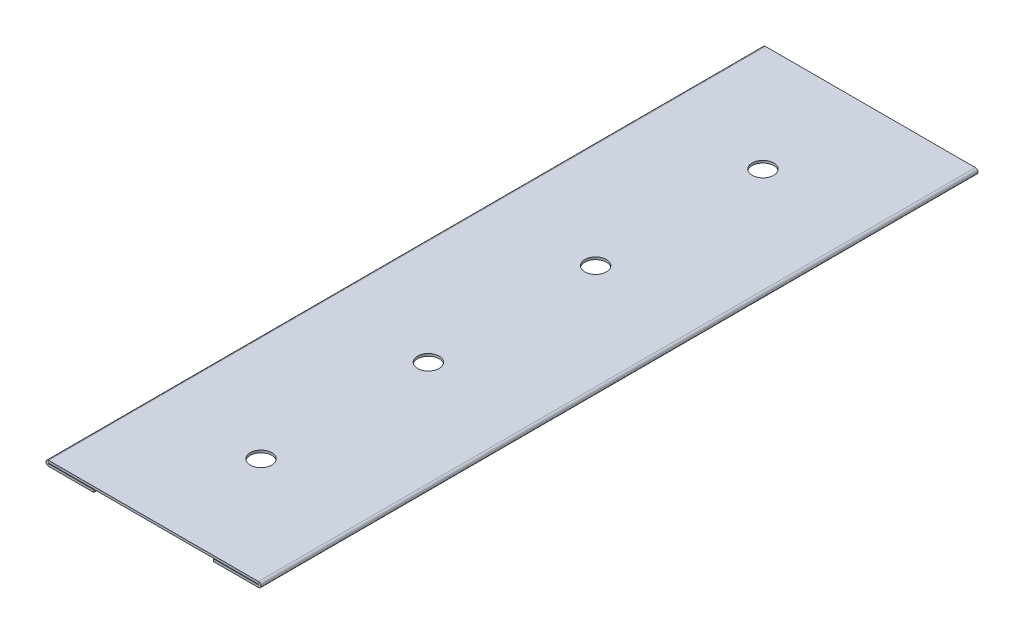
ISO-10303-21;
HEADER;
FILE_DESCRIPTION(('STEP AP214'),'2;1');
FILE_NAME('part.step','',(''),(''),'','','');
FILE_SCHEMA(('AUTOMOTIVE_DESIGN { 1 0 10303 214 1 1 1 1 }'));
ENDSEC;
DATA;
#1=APPLICATION_CONTEXT('core data for automotive mechanical design processes');
#2=APPLICATION_PROTOCOL_DEFINITION('international standard','automotive_design',2000,#1);
#3=PRODUCT_CONTEXT('',#1,'mechanical');
#4=PRODUCT('Part','Part','',(#3));
#5=PRODUCT_RELATED_PRODUCT_CATEGORY('part','',(#4));
#6=PRODUCT_DEFINITION_FORMATION('','',#4);
#7=PRODUCT_DEFINITION_CONTEXT('part definition',#1,'design');
#8=PRODUCT_DEFINITION('design','',#6,#7);
#9=PRODUCT_DEFINITION_SHAPE('','',#8);
#10=(LENGTH_UNIT() NAMED_UNIT(*) SI_UNIT(.MILLI.,.METRE.));
#11=(NAMED_UNIT(*) PLANE_ANGLE_UNIT() SI_UNIT($,.RADIAN.));
#12=(NAMED_UNIT(*) SI_UNIT($,.STERADIAN.) SOLID_ANGLE_UNIT());
#13=UNCERTAINTY_MEASURE_WITH_UNIT(LENGTH_MEASURE(1.E-05),#10,'distance_accuracy_value','');
#14=(GEOMETRIC_REPRESENTATION_CONTEXT(3) GLOBAL_UNCERTAINTY_ASSIGNED_CONTEXT((#13)) GLOBAL_UNIT_ASSIGNED_CONTEXT((#10,
#11,#12)) REPRESENTATION_CONTEXT('',''));
#15=CARTESIAN_POINT('',(0.,0.,0.));
#16=DIRECTION('',(0.,0.,1.));
#17=DIRECTION('',(1.,0.,0.));
#18=AXIS2_PLACEMENT_3D('',#15,#16,#17);
#19=CARTESIAN_POINT('',(-22.5,0.5,-75.));
#20=DIRECTION('',(0.,0.,1.));
#21=DIRECTION('',(-1.,0.,0.));
#22=AXIS2_PLACEMENT_3D('',#19,#20,#21);
#23=PLANE('',#22);
#24=DIRECTION('',(1.,0.,0.));
#25=VECTOR('',#24,1.);
#26=CARTESIAN_POINT('',(0.,0.,-75.));
#27=LINE('',#26,#25);
#28=CARTESIAN_POINT('',(21.95,0.,-75.));
#29=VERTEX_POINT('',#28);
#30=CARTESIAN_POINT('',(-21.95,0.,-75.));
#31=VERTEX_POINT('',#30);
#32=EDGE_CURVE('E42',#29,#31,#27,.F.);
#33=ORIENTED_EDGE('',*,*,#32,.T.);
#34=DIRECTION('',(0.,1.,0.));
#35=VECTOR('',#34,1.);
#36=CARTESIAN_POINT('',(-21.95,0.,-75.));
#37=LINE('',#36,#35);
#38=CARTESIAN_POINT('',(-21.95,0.5,-75.));
#39=VERTEX_POINT('',#38);
#40=EDGE_CURVE('E55',#31,#39,#37,.T.);
#41=ORIENTED_EDGE('',*,*,#40,.T.);
#42=DIRECTION('',(-1.,0.,0.));
#43=VECTOR('',#42,1.);
#44=CARTESIAN_POINT('',(-22.5,0.5,-75.));
#45=LINE('',#44,#43);
#46=CARTESIAN_POINT('',(21.95,0.5,-75.));
#47=VERTEX_POINT('',#46);
#48=EDGE_CURVE('E47',#47,#39,#45,.T.);
#49=ORIENTED_EDGE('',*,*,#48,.F.);
#50=DIRECTION('',(0.,1.,0.));
#51=VECTOR('',#50,1.);
#52=CARTESIAN_POINT('',(21.95,0.,-75.));
#53=LINE('',#52,#51);
#54=EDGE_CURVE('E215',#29,#47,#53,.T.);
#55=ORIENTED_EDGE('',*,*,#54,.F.);
#56=EDGE_LOOP('',(#33,#41,#49,#55));
#57=FACE_BOUND('',#56,.T.);
#58=ADVANCED_FACE('F39',(#57),#23,.F.);
#59=CARTESIAN_POINT('',(-22.5,0.5,75.));
#60=DIRECTION('',(0.,0.,-1.));
#61=DIRECTION('',(1.,0.,0.));
#62=AXIS2_PLACEMENT_3D('',#59,#60,#61);
#63=PLANE('',#62);
#64=DIRECTION('',(0.,1.,0.));
#65=VECTOR('',#64,1.);
#66=CARTESIAN_POINT('',(-21.95,0.,75.));
#67=LINE('',#66,#65);
#68=CARTESIAN_POINT('',(-21.95,0.,75.));
#69=VERTEX_POINT('',#68);
#70=CARTESIAN_POINT('',(-21.95,0.5,75.));
#71=VERTEX_POINT('',#70);
#72=EDGE_CURVE('E131',#69,#71,#67,.T.);
#73=ORIENTED_EDGE('',*,*,#72,.F.);
#74=DIRECTION('',(1.,0.,0.));
#75=VECTOR('',#74,1.);
#76=CARTESIAN_POINT('',(0.,0.,75.));
#77=LINE('',#76,#75);
#78=CARTESIAN_POINT('',(21.95,0.,75.));
#79=VERTEX_POINT('',#78);
#80=EDGE_CURVE('E257',#69,#79,#77,.T.);
#81=ORIENTED_EDGE('',*,*,#80,.T.);
#82=DIRECTION('',(0.,1.,0.));
#83=VECTOR('',#82,1.);
#84=CARTESIAN_POINT('',(21.95,0.,75.));
#85=LINE('',#84,#83);
#86=CARTESIAN_POINT('',(21.95,0.5,75.));
#87=VERTEX_POINT('',#86);
#88=EDGE_CURVE('E133',#79,#87,#85,.T.);
#89=ORIENTED_EDGE('',*,*,#88,.T.);
#90=DIRECTION('',(1.,0.,0.));
#91=VECTOR('',#90,1.);
#92=CARTESIAN_POINT('',(-22.5,0.5,75.));
#93=LINE('',#92,#91);
#94=EDGE_CURVE('E11',#71,#87,#93,.T.);
#95=ORIENTED_EDGE('',*,*,#94,.F.);
#96=EDGE_LOOP('',(#73,#81,#89,#95));
#97=FACE_BOUND('',#96,.T.);
#98=ADVANCED_FACE('F129',(#97),#63,.F.);
#99=CARTESIAN_POINT('',(2.59818126908183E-12,0.5,52.5));
#100=DIRECTION('',(0.,-1.,0.));
#101=DIRECTION('',(0.,0.,-1.));
#102=AXIS2_PLACEMENT_3D('',#99,#100,#101);
#103=CYLINDRICAL_SURFACE('',#102,2.25);
#104=CARTESIAN_POINT('',(2.59818126908183E-12,0.5,52.5));
#105=DIRECTION('',(0.,1.,0.));
#106=DIRECTION('',(0.,0.,1.));
#107=AXIS2_PLACEMENT_3D('',#104,#105,#106);
#108=CIRCLE('',#107,2.25);
#109=CARTESIAN_POINT('',(2.59818126908183E-12,0.5,54.75));
#110=VERTEX_POINT('',#109);
#111=EDGE_CURVE('E253',#110,#110,#108,.T.);
#112=ORIENTED_EDGE('',*,*,#111,.T.);
#113=EDGE_LOOP('',(#112));
#114=FACE_BOUND('',#113,.T.);
#115=CARTESIAN_POINT('',(2.59818126908183E-12,0.,52.5));
#116=DIRECTION('',(0.,1.,0.));
#117=DIRECTION('',(0.,0.,1.));
#118=AXIS2_PLACEMENT_3D('',#115,#116,#117);
#119=CIRCLE('',#118,2.25);
#120=CARTESIAN_POINT('',(2.59818126908183E-12,0.,54.75));
#121=VERTEX_POINT('',#120);
#122=EDGE_CURVE('E251',#121,#121,#119,.T.);
#123=ORIENTED_EDGE('',*,*,#122,.F.);
#124=EDGE_LOOP('',(#123));
#125=FACE_BOUND('',#124,.T.);
#126=ADVANCED_FACE('F313',(#114,#125),#103,.F.);
#127=CARTESIAN_POINT('',(1.73419581347123E-12,0.5,17.5));
#128=DIRECTION('',(0.,-1.,0.));
#129=DIRECTION('',(0.,0.,-1.));
#130=AXIS2_PLACEMENT_3D('',#127,#128,#129);
#131=CYLINDRICAL_SURFACE('',#130,2.25);
#132=CARTESIAN_POINT('',(1.73419581347123E-12,0.5,17.5));
#133=DIRECTION('',(0.,1.,0.));
#134=DIRECTION('',(0.,0.,1.));
#135=AXIS2_PLACEMENT_3D('',#132,#133,#134);
#136=CIRCLE('',#135,2.25);
#137=CARTESIAN_POINT('',(1.73419581347123E-12,0.5,19.75));
#138=VERTEX_POINT('',#137);
#139=EDGE_CURVE('E256',#138,#138,#136,.T.);
#140=ORIENTED_EDGE('',*,*,#139,.T.);
#141=EDGE_LOOP('',(#140));
#142=FACE_BOUND('',#141,.T.);
#143=CARTESIAN_POINT('',(1.73419581347123E-12,0.,17.5));
#144=DIRECTION('',(0.,1.,0.));
#145=DIRECTION('',(0.,0.,1.));
#146=AXIS2_PLACEMENT_3D('',#143,#144,#145);
#147=CIRCLE('',#146,2.25);
#148=CARTESIAN_POINT('',(1.73419581347123E-12,0.,19.75));
#149=VERTEX_POINT('',#148);
#150=EDGE_CURVE('E269',#149,#149,#147,.T.);
#151=ORIENTED_EDGE('',*,*,#150,.F.);
#152=EDGE_LOOP('',(#151));
#153=FACE_BOUND('',#152,.T.);
#154=ADVANCED_FACE('F317',(#142,#153),#131,.F.);
#155=CARTESIAN_POINT('',(0.,0.5,-52.5));
#156=DIRECTION('',(0.,-1.,0.));
#157=DIRECTION('',(0.,0.,-1.));
#158=AXIS2_PLACEMENT_3D('',#155,#156,#157);
#159=CYLINDRICAL_SURFACE('',#158,2.25);
#160=CARTESIAN_POINT('',(0.,0.5,-52.5));
#161=DIRECTION('',(0.,1.,0.));
#162=DIRECTION('',(0.,0.,1.));
#163=AXIS2_PLACEMENT_3D('',#160,#161,#162);
#164=CIRCLE('',#163,2.25);
#165=CARTESIAN_POINT('',(0.,0.5,-50.25));
#166=VERTEX_POINT('',#165);
#167=EDGE_CURVE('E260',#166,#166,#164,.T.);
#168=ORIENTED_EDGE('',*,*,#167,.T.);
#169=EDGE_LOOP('',(#168));
#170=FACE_BOUND('',#169,.T.);
#171=CARTESIAN_POINT('',(0.,0.,-52.5));
#172=DIRECTION('',(0.,1.,0.));
#173=DIRECTION('',(0.,0.,1.));
#174=AXIS2_PLACEMENT_3D('',#171,#172,#173);
#175=CIRCLE('',#174,2.25);
#176=CARTESIAN_POINT('',(0.,0.,-50.25));
#177=VERTEX_POINT('',#176);
#178=EDGE_CURVE('E272',#177,#177,#175,.T.);
#179=ORIENTED_EDGE('',*,*,#178,.F.);
#180=EDGE_LOOP('',(#179));
#181=FACE_BOUND('',#180,.T.);
#182=ADVANCED_FACE('F324',(#170,#181),#159,.F.);
#183=CARTESIAN_POINT('',(8.70210357860634E-13,0.5,-17.5));
#184=DIRECTION('',(0.,-1.,0.));
#185=DIRECTION('',(0.,0.,-1.));
#186=AXIS2_PLACEMENT_3D('',#183,#184,#185);
#187=CYLINDRICAL_SURFACE('',#186,2.25);
#188=CARTESIAN_POINT('',(8.70210357860634E-13,0.5,-17.5));
#189=DIRECTION('',(0.,1.,0.));
#190=DIRECTION('',(0.,0.,1.));
#191=AXIS2_PLACEMENT_3D('',#188,#189,#190);
#192=CIRCLE('',#191,2.25);
#193=CARTESIAN_POINT('',(8.70210357860634E-13,0.5,-15.25));
#194=VERTEX_POINT('',#193);
#195=EDGE_CURVE('E263',#194,#194,#192,.T.);
#196=ORIENTED_EDGE('',*,*,#195,.T.);
#197=EDGE_LOOP('',(#196));
#198=FACE_BOUND('',#197,.T.);
#199=CARTESIAN_POINT('',(8.70210357860634E-13,0.,-17.5));
#200=DIRECTION('',(0.,1.,0.));
#201=DIRECTION('',(0.,0.,1.));
#202=AXIS2_PLACEMENT_3D('',#199,#200,#201);
#203=CIRCLE('',#202,2.25);
#204=CARTESIAN_POINT('',(8.70210357860634E-13,0.,-15.25));
#205=VERTEX_POINT('',#204);
#206=EDGE_CURVE('E275',#205,#205,#203,.T.);
#207=ORIENTED_EDGE('',*,*,#206,.F.);
#208=EDGE_LOOP('',(#207));
#209=FACE_BOUND('',#208,.T.);
#210=ADVANCED_FACE('F321',(#198,#209),#187,.F.);
#211=CARTESIAN_POINT('',(0.,0.5,0.));
#212=DIRECTION('',(0.,-1.,0.));
#213=DIRECTION('',(0.,0.,-1.));
#214=AXIS2_PLACEMENT_3D('',#211,#212,#213);
#215=PLANE('',#214);
#216=ORIENTED_EDGE('',*,*,#111,.F.);
#217=EDGE_LOOP('',(#216));
#218=FACE_BOUND('',#217,.T.);
#219=ORIENTED_EDGE('',*,*,#139,.F.);
#220=EDGE_LOOP('',(#219));
#221=FACE_BOUND('',#220,.T.);
#222=ORIENTED_EDGE('',*,*,#167,.F.);
#223=EDGE_LOOP('',(#222));
#224=FACE_BOUND('',#223,.T.);
#225=ORIENTED_EDGE('',*,*,#195,.F.);
#226=EDGE_LOOP('',(#225));
#227=FACE_BOUND('',#226,.T.);
#228=ORIENTED_EDGE('',*,*,#48,.T.);
#229=DIRECTION('',(0.,0.,-1.));
#230=VECTOR('',#229,1.);
#231=CARTESIAN_POINT('',(-21.95,0.5,-75.));
#232=LINE('',#231,#230);
#233=EDGE_CURVE('E138',#39,#71,#232,.F.);
#234=ORIENTED_EDGE('',*,*,#233,.T.);
#235=ORIENTED_EDGE('',*,*,#94,.T.);
#236=DIRECTION('',(0.,0.,1.));
#237=VECTOR('',#236,1.);
#238=CARTESIAN_POINT('',(21.95,0.5,75.));
#239=LINE('',#238,#237);
#240=EDGE_CURVE('E199',#87,#47,#239,.F.);
#241=ORIENTED_EDGE('',*,*,#240,.T.);
#242=EDGE_LOOP('',(#228,#234,#235,#241));
#243=FACE_BOUND('',#242,.T.);
#244=ADVANCED_FACE('F139',(#218,#221,#224,#227,#243),#215,.F.);
#245=CARTESIAN_POINT('',(0.,0.,0.));
#246=DIRECTION('',(0.,-1.,0.));
#247=DIRECTION('',(0.,0.,-1.));
#248=AXIS2_PLACEMENT_3D('',#245,#246,#247);
#249=PLANE('',#248);
#250=DIRECTION('',(0.,0.,-1.));
#251=VECTOR('',#250,1.);
#252=CARTESIAN_POINT('',(-21.95,0.,-75.));
#253=LINE('',#252,#251);
#254=EDGE_CURVE('E63',#31,#69,#253,.F.);
#255=ORIENTED_EDGE('',*,*,#254,.F.);
#256=ORIENTED_EDGE('',*,*,#32,.F.);
#257=DIRECTION('',(0.,0.,1.));
#258=VECTOR('',#257,1.);
#259=CARTESIAN_POINT('',(21.95,0.,75.));
#260=LINE('',#259,#258);
#261=EDGE_CURVE('E210',#79,#29,#260,.F.);
#262=ORIENTED_EDGE('',*,*,#261,.F.);
#263=ORIENTED_EDGE('',*,*,#80,.F.);
#264=EDGE_LOOP('',(#255,#256,#262,#263));
#265=FACE_BOUND('',#264,.T.);
#266=ORIENTED_EDGE('',*,*,#122,.T.);
#267=EDGE_LOOP('',(#266));
#268=FACE_BOUND('',#267,.T.);
#269=ORIENTED_EDGE('',*,*,#150,.T.);
#270=EDGE_LOOP('',(#269));
#271=FACE_BOUND('',#270,.T.);
#272=ORIENTED_EDGE('',*,*,#178,.T.);
#273=EDGE_LOOP('',(#272));
#274=FACE_BOUND('',#273,.T.);
#275=ORIENTED_EDGE('',*,*,#206,.T.);
#276=EDGE_LOOP('',(#275));
#277=FACE_BOUND('',#276,.T.);
#278=ADVANCED_FACE('F332',(#265,#268,#271,#274,#277),#249,.T.);
#279=CARTESIAN_POINT('',(17.225,-0.6,75.));
#280=DIRECTION('',(0.,0.,-1.));
#281=DIRECTION('',(1.,0.,0.));
#282=AXIS2_PLACEMENT_3D('',#279,#280,#281);
#283=PLANE('',#282);
#284=DIRECTION('',(0.,-1.,0.));
#285=VECTOR('',#284,1.);
#286=CARTESIAN_POINT('',(21.95,-0.6,75.));
#287=LINE('',#286,#285);
#288=CARTESIAN_POINT('',(21.95,-0.1,75.));
#289=VERTEX_POINT('',#288);
#290=CARTESIAN_POINT('',(21.95,-0.6,75.));
#291=VERTEX_POINT('',#290);
#292=EDGE_CURVE('E245',#289,#291,#287,.T.);
#293=ORIENTED_EDGE('',*,*,#292,.F.);
#294=DIRECTION('',(1.,0.,0.));
#295=VECTOR('',#294,1.);
#296=CARTESIAN_POINT('',(17.225,-0.1,75.));
#297=LINE('',#296,#295);
#298=CARTESIAN_POINT('',(12.5,-0.1,75.));
#299=VERTEX_POINT('',#298);
#300=EDGE_CURVE('E236',#299,#289,#297,.T.);
#301=ORIENTED_EDGE('',*,*,#300,.F.);
#302=DIRECTION('',(0.,-1.,0.));
#303=VECTOR('',#302,1.);
#304=CARTESIAN_POINT('',(12.5,-0.6,75.));
#305=LINE('',#304,#303);
#306=CARTESIAN_POINT('',(12.5,-0.6,75.));
#307=VERTEX_POINT('',#306);
#308=EDGE_CURVE('E243',#299,#307,#305,.T.);
#309=ORIENTED_EDGE('',*,*,#308,.T.);
#310=DIRECTION('',(1.,0.,0.));
#311=VECTOR('',#310,1.);
#312=CARTESIAN_POINT('',(17.225,-0.6,75.));
#313=LINE('',#312,#311);
#314=EDGE_CURVE('E224',#307,#291,#313,.T.);
#315=ORIENTED_EDGE('',*,*,#314,.T.);
#316=EDGE_LOOP('',(#293,#301,#309,#315));
#317=FACE_BOUND('',#316,.T.);
#318=ADVANCED_FACE('F335',(#317),#283,.F.);
#319=CARTESIAN_POINT('',(12.5,-0.6,0.));
#320=DIRECTION('',(1.,0.,0.));
#321=DIRECTION('',(0.,0.,1.));
#322=AXIS2_PLACEMENT_3D('',#319,#320,#321);
#323=PLANE('',#322);
#324=ORIENTED_EDGE('',*,*,#308,.F.);
#325=DIRECTION('',(0.,0.,-1.));
#326=VECTOR('',#325,1.);
#327=CARTESIAN_POINT('',(12.5,-0.1,0.));
#328=LINE('',#327,#326);
#329=CARTESIAN_POINT('',(12.5,-0.1,-75.));
#330=VERTEX_POINT('',#329);
#331=EDGE_CURVE('E233',#330,#299,#328,.F.);
#332=ORIENTED_EDGE('',*,*,#331,.F.);
#333=DIRECTION('',(0.,-1.,0.));
#334=VECTOR('',#333,1.);
#335=CARTESIAN_POINT('',(12.5,-0.6,-75.));
#336=LINE('',#335,#334);
#337=CARTESIAN_POINT('',(12.5,-0.6,-75.));
#338=VERTEX_POINT('',#337);
#339=EDGE_CURVE('E223',#330,#338,#336,.T.);
#340=ORIENTED_EDGE('',*,*,#339,.T.);
#341=DIRECTION('',(0.,0.,1.));
#342=VECTOR('',#341,1.);
#343=CARTESIAN_POINT('',(12.5,-0.6,0.));
#344=LINE('',#343,#342);
#345=EDGE_CURVE('E220',#338,#307,#344,.T.);
#346=ORIENTED_EDGE('',*,*,#345,.T.);
#347=EDGE_LOOP('',(#324,#332,#340,#346));
#348=FACE_BOUND('',#347,.T.);
#349=ADVANCED_FACE('F343',(#348),#323,.F.);
#350=CARTESIAN_POINT('',(17.225,-0.6,-75.));
#351=DIRECTION('',(0.,0.,1.));
#352=DIRECTION('',(-1.,0.,0.));
#353=AXIS2_PLACEMENT_3D('',#350,#351,#352);
#354=PLANE('',#353);
#355=DIRECTION('',(1.,0.,0.));
#356=VECTOR('',#355,1.);
#357=CARTESIAN_POINT('',(17.225,-0.1,-75.));
#358=LINE('',#357,#356);
#359=CARTESIAN_POINT('',(21.95,-0.1,-75.));
#360=VERTEX_POINT('',#359);
#361=EDGE_CURVE('E218',#360,#330,#358,.F.);
#362=ORIENTED_EDGE('',*,*,#361,.F.);
#363=DIRECTION('',(0.,-1.,0.));
#364=VECTOR('',#363,1.);
#365=CARTESIAN_POINT('',(21.95,-0.6,-75.));
#366=LINE('',#365,#364);
#367=CARTESIAN_POINT('',(21.95,-0.6,-75.));
#368=VERTEX_POINT('',#367);
#369=EDGE_CURVE('E248',#360,#368,#366,.T.);
#370=ORIENTED_EDGE('',*,*,#369,.T.);
#371=DIRECTION('',(-1.,0.,0.));
#372=VECTOR('',#371,1.);
#373=CARTESIAN_POINT('',(17.225,-0.6,-75.));
#374=LINE('',#373,#372);
#375=EDGE_CURVE('E230',#368,#338,#374,.T.);
#376=ORIENTED_EDGE('',*,*,#375,.T.);
#377=ORIENTED_EDGE('',*,*,#339,.F.);
#378=EDGE_LOOP('',(#362,#370,#376,#377));
#379=FACE_BOUND('',#378,.T.);
#380=ADVANCED_FACE('F339',(#379),#354,.F.);
#381=CARTESIAN_POINT('',(17.225,-0.6,0.));
#382=DIRECTION('',(0.,-1.,0.));
#383=DIRECTION('',(0.,0.,-1.));
#384=AXIS2_PLACEMENT_3D('',#381,#382,#383);
#385=PLANE('',#384);
#386=ORIENTED_EDGE('',*,*,#345,.F.);
#387=ORIENTED_EDGE('',*,*,#375,.F.);
#388=DIRECTION('',(0.,0.,-1.));
#389=VECTOR('',#388,1.);
#390=CARTESIAN_POINT('',(21.95,-0.6,0.));
#391=LINE('',#390,#389);
#392=EDGE_CURVE('E227',#291,#368,#391,.T.);
#393=ORIENTED_EDGE('',*,*,#392,.F.);
#394=ORIENTED_EDGE('',*,*,#314,.F.);
#395=EDGE_LOOP('',(#386,#387,#393,#394));
#396=FACE_BOUND('',#395,.T.);
#397=ADVANCED_FACE('F342',(#396),#385,.T.);
#398=CARTESIAN_POINT('',(17.225,-0.1,0.));
#399=DIRECTION('',(0.,-1.,0.));
#400=DIRECTION('',(0.,0.,-1.));
#401=AXIS2_PLACEMENT_3D('',#398,#399,#400);
#402=PLANE('',#401);
#403=ORIENTED_EDGE('',*,*,#331,.T.);
#404=ORIENTED_EDGE('',*,*,#300,.T.);
#405=DIRECTION('',(0.,0.,-1.));
#406=VECTOR('',#405,1.);
#407=CARTESIAN_POINT('',(21.95,-0.1,0.));
#408=LINE('',#407,#406);
#409=EDGE_CURVE('E239',#289,#360,#408,.T.);
#410=ORIENTED_EDGE('',*,*,#409,.T.);
#411=ORIENTED_EDGE('',*,*,#361,.T.);
#412=EDGE_LOOP('',(#403,#404,#410,#411));
#413=FACE_BOUND('',#412,.T.);
#414=ADVANCED_FACE('F351',(#413),#402,.F.);
#415=CARTESIAN_POINT('',(21.95,-0.05,-75.));
#416=DIRECTION('',(0.,0.,-1.));
#417=DIRECTION('',(-1.,0.,0.));
#418=AXIS2_PLACEMENT_3D('',#415,#416,#417);
#419=PLANE('',#418);
#420=ORIENTED_EDGE('',*,*,#369,.F.);
#421=CARTESIAN_POINT('',(21.95,-0.05,-75.));
#422=DIRECTION('',(0.,0.,1.));
#423=DIRECTION('',(1.,0.,0.));
#424=AXIS2_PLACEMENT_3D('',#421,#422,#423);
#425=CIRCLE('',#424,0.05);
#426=EDGE_CURVE('E207',#29,#360,#425,.F.);
#427=ORIENTED_EDGE('',*,*,#426,.F.);
#428=ORIENTED_EDGE('',*,*,#54,.T.);
#429=CARTESIAN_POINT('',(21.95,-0.05,-75.));
#430=DIRECTION('',(0.,0.,1.));
#431=DIRECTION('',(1.,0.,0.));
#432=AXIS2_PLACEMENT_3D('',#429,#430,#431);
#433=CIRCLE('',#432,0.55);
#434=EDGE_CURVE('E201',#47,#368,#433,.F.);
#435=ORIENTED_EDGE('',*,*,#434,.T.);
#436=EDGE_LOOP('',(#420,#427,#428,#435));
#437=FACE_BOUND('',#436,.T.);
#438=ADVANCED_FACE('F354',(#437),#419,.T.);
#439=CARTESIAN_POINT('',(21.95,-0.05,75.));
#440=DIRECTION('',(0.,0.,-1.));
#441=DIRECTION('',(-1.,0.,0.));
#442=AXIS2_PLACEMENT_3D('',#439,#440,#441);
#443=PLANE('',#442);
#444=CARTESIAN_POINT('',(21.95,-0.05,75.));
#445=DIRECTION('',(0.,0.,1.));
#446=DIRECTION('',(1.,0.,0.));
#447=AXIS2_PLACEMENT_3D('',#444,#445,#446);
#448=CIRCLE('',#447,0.05);
#449=EDGE_CURVE('E197',#289,#79,#448,.T.);
#450=ORIENTED_EDGE('',*,*,#449,.F.);
#451=ORIENTED_EDGE('',*,*,#292,.T.);
#452=CARTESIAN_POINT('',(21.95,-0.05,75.));
#453=DIRECTION('',(0.,0.,1.));
#454=DIRECTION('',(1.,0.,0.));
#455=AXIS2_PLACEMENT_3D('',#452,#453,#454);
#456=CIRCLE('',#455,0.55);
#457=EDGE_CURVE('E202',#291,#87,#456,.T.);
#458=ORIENTED_EDGE('',*,*,#457,.T.);
#459=ORIENTED_EDGE('',*,*,#88,.F.);
#460=EDGE_LOOP('',(#450,#451,#458,#459));
#461=FACE_BOUND('',#460,.T.);
#462=ADVANCED_FACE('F359',(#461),#443,.F.);
#463=CARTESIAN_POINT('',(21.95,-0.05,75.));
#464=DIRECTION('',(0.,0.,1.));
#465=DIRECTION('',(0.,-1.,0.));
#466=AXIS2_PLACEMENT_3D('',#463,#464,#465);
#467=CYLINDRICAL_SURFACE('',#466,0.55);
#468=ORIENTED_EDGE('',*,*,#240,.F.);
#469=ORIENTED_EDGE('',*,*,#457,.F.);
#470=ORIENTED_EDGE('',*,*,#392,.T.);
#471=ORIENTED_EDGE('',*,*,#434,.F.);
#472=EDGE_LOOP('',(#468,#469,#470,#471));
#473=FACE_BOUND('',#472,.T.);
#474=ADVANCED_FACE('F362',(#473),#467,.T.);
#475=CARTESIAN_POINT('',(21.95,-0.05,75.));
#476=DIRECTION('',(0.,0.,1.));
#477=DIRECTION('',(0.,-1.,0.));
#478=AXIS2_PLACEMENT_3D('',#475,#476,#477);
#479=CYLINDRICAL_SURFACE('',#478,0.05);
#480=ORIENTED_EDGE('',*,*,#261,.T.);
#481=ORIENTED_EDGE('',*,*,#426,.T.);
#482=ORIENTED_EDGE('',*,*,#409,.F.);
#483=ORIENTED_EDGE('',*,*,#449,.T.);
#484=EDGE_LOOP('',(#480,#481,#482,#483));
#485=FACE_BOUND('',#484,.T.);
#486=ADVANCED_FACE('F367',(#485),#479,.F.);
#487=CARTESIAN_POINT('',(-17.225,-0.6,-75.));
#488=DIRECTION('',(0.,0.,1.));
#489=DIRECTION('',(-1.,0.,0.));
#490=AXIS2_PLACEMENT_3D('',#487,#488,#489);
#491=PLANE('',#490);
#492=DIRECTION('',(0.,-1.,0.));
#493=VECTOR('',#492,1.);
#494=CARTESIAN_POINT('',(-21.95,-0.6,-75.));
#495=LINE('',#494,#493);
#496=CARTESIAN_POINT('',(-21.95,-0.1,-75.));
#497=VERTEX_POINT('',#496);
#498=CARTESIAN_POINT('',(-21.95,-0.6,-75.));
#499=VERTEX_POINT('',#498);
#500=EDGE_CURVE('E191',#497,#499,#495,.T.);
#501=ORIENTED_EDGE('',*,*,#500,.F.);
#502=DIRECTION('',(1.,0.,0.));
#503=VECTOR('',#502,1.);
#504=CARTESIAN_POINT('',(-17.225,-0.1,-75.));
#505=LINE('',#504,#503);
#506=CARTESIAN_POINT('',(-12.5,-0.1,-75.));
#507=VERTEX_POINT('',#506);
#508=EDGE_CURVE('E182',#507,#497,#505,.F.);
#509=ORIENTED_EDGE('',*,*,#508,.F.);
#510=DIRECTION('',(0.,-1.,0.));
#511=VECTOR('',#510,1.);
#512=CARTESIAN_POINT('',(-12.5,-0.6,-75.));
#513=LINE('',#512,#511);
#514=CARTESIAN_POINT('',(-12.5,-0.6,-75.));
#515=VERTEX_POINT('',#514);
#516=EDGE_CURVE('E189',#507,#515,#513,.T.);
#517=ORIENTED_EDGE('',*,*,#516,.T.);
#518=DIRECTION('',(-1.,0.,0.));
#519=VECTOR('',#518,1.);
#520=CARTESIAN_POINT('',(-17.225,-0.6,-75.));
#521=LINE('',#520,#519);
#522=EDGE_CURVE('E172',#515,#499,#521,.T.);
#523=ORIENTED_EDGE('',*,*,#522,.T.);
#524=EDGE_LOOP('',(#501,#509,#517,#523));
#525=FACE_BOUND('',#524,.T.);
#526=ADVANCED_FACE('F297',(#525),#491,.F.);
#527=CARTESIAN_POINT('',(-12.5,-0.6,0.));
#528=DIRECTION('',(-1.,0.,0.));
#529=DIRECTION('',(0.,0.,-1.));
#530=AXIS2_PLACEMENT_3D('',#527,#528,#529);
#531=PLANE('',#530);
#532=ORIENTED_EDGE('',*,*,#516,.F.);
#533=DIRECTION('',(0.,0.,-1.));
#534=VECTOR('',#533,1.);
#535=CARTESIAN_POINT('',(-12.5,-0.1,0.));
#536=LINE('',#535,#534);
#537=CARTESIAN_POINT('',(-12.5,-0.1,75.));
#538=VERTEX_POINT('',#537);
#539=EDGE_CURVE('E179',#538,#507,#536,.T.);
#540=ORIENTED_EDGE('',*,*,#539,.F.);
#541=DIRECTION('',(0.,-1.,0.));
#542=VECTOR('',#541,1.);
#543=CARTESIAN_POINT('',(-12.5,-0.6,75.));
#544=LINE('',#543,#542);
#545=CARTESIAN_POINT('',(-12.5,-0.6,75.));
#546=VERTEX_POINT('',#545);
#547=EDGE_CURVE('E171',#538,#546,#544,.T.);
#548=ORIENTED_EDGE('',*,*,#547,.T.);
#549=DIRECTION('',(0.,0.,-1.));
#550=VECTOR('',#549,1.);
#551=CARTESIAN_POINT('',(-12.5,-0.6,0.));
#552=LINE('',#551,#550);
#553=EDGE_CURVE('E168',#546,#515,#552,.T.);
#554=ORIENTED_EDGE('',*,*,#553,.T.);
#555=EDGE_LOOP('',(#532,#540,#548,#554));
#556=FACE_BOUND('',#555,.T.);
#557=ADVANCED_FACE('F294',(#556),#531,.F.);
#558=CARTESIAN_POINT('',(-17.225,-0.6,75.));
#559=DIRECTION('',(0.,0.,-1.));
#560=DIRECTION('',(1.,0.,0.));
#561=AXIS2_PLACEMENT_3D('',#558,#559,#560);
#562=PLANE('',#561);
#563=DIRECTION('',(1.,0.,0.));
#564=VECTOR('',#563,1.);
#565=CARTESIAN_POINT('',(-17.225,-0.1,75.));
#566=LINE('',#565,#564);
#567=CARTESIAN_POINT('',(-21.95,-0.1,75.));
#568=VERTEX_POINT('',#567);
#569=EDGE_CURVE('E154',#568,#538,#566,.T.);
#570=ORIENTED_EDGE('',*,*,#569,.F.);
#571=DIRECTION('',(0.,-1.,0.));
#572=VECTOR('',#571,1.);
#573=CARTESIAN_POINT('',(-21.95,-0.6,75.));
#574=LINE('',#573,#572);
#575=CARTESIAN_POINT('',(-21.95,-0.6,75.));
#576=VERTEX_POINT('',#575);
#577=EDGE_CURVE('E194',#568,#576,#574,.T.);
#578=ORIENTED_EDGE('',*,*,#577,.T.);
#579=DIRECTION('',(1.,0.,0.));
#580=VECTOR('',#579,1.);
#581=CARTESIAN_POINT('',(-17.225,-0.6,75.));
#582=LINE('',#581,#580);
#583=EDGE_CURVE('E176',#576,#546,#582,.T.);
#584=ORIENTED_EDGE('',*,*,#583,.T.);
#585=ORIENTED_EDGE('',*,*,#547,.F.);
#586=EDGE_LOOP('',(#570,#578,#584,#585));
#587=FACE_BOUND('',#586,.T.);
#588=ADVANCED_FACE('F291',(#587),#562,.F.);
#589=CARTESIAN_POINT('',(-17.225,-0.6,0.));
#590=DIRECTION('',(0.,-1.,0.));
#591=DIRECTION('',(0.,0.,-1.));
#592=AXIS2_PLACEMENT_3D('',#589,#590,#591);
#593=PLANE('',#592);
#594=ORIENTED_EDGE('',*,*,#553,.F.);
#595=ORIENTED_EDGE('',*,*,#583,.F.);
#596=DIRECTION('',(0.,0.,1.));
#597=VECTOR('',#596,1.);
#598=CARTESIAN_POINT('',(-21.95,-0.6,0.));
#599=LINE('',#598,#597);
#600=EDGE_CURVE('E158',#499,#576,#599,.T.);
#601=ORIENTED_EDGE('',*,*,#600,.F.);
#602=ORIENTED_EDGE('',*,*,#522,.F.);
#603=EDGE_LOOP('',(#594,#595,#601,#602));
#604=FACE_BOUND('',#603,.T.);
#605=ADVANCED_FACE('F299',(#604),#593,.T.);
#606=CARTESIAN_POINT('',(-17.225,-0.1,0.));
#607=DIRECTION('',(0.,-1.,0.));
#608=DIRECTION('',(0.,0.,-1.));
#609=AXIS2_PLACEMENT_3D('',#606,#607,#608);
#610=PLANE('',#609);
#611=ORIENTED_EDGE('',*,*,#539,.T.);
#612=ORIENTED_EDGE('',*,*,#508,.T.);
#613=DIRECTION('',(0.,0.,-1.));
#614=VECTOR('',#613,1.);
#615=CARTESIAN_POINT('',(-21.95,-0.1,0.));
#616=LINE('',#615,#614);
#617=EDGE_CURVE('E185',#497,#568,#616,.F.);
#618=ORIENTED_EDGE('',*,*,#617,.T.);
#619=ORIENTED_EDGE('',*,*,#569,.T.);
#620=EDGE_LOOP('',(#611,#612,#618,#619));
#621=FACE_BOUND('',#620,.T.);
#622=ADVANCED_FACE('F287',(#621),#610,.F.);
#623=CARTESIAN_POINT('',(-21.95,-0.05,75.));
#624=DIRECTION('',(0.,0.,1.));
#625=DIRECTION('',(1.,0.,0.));
#626=AXIS2_PLACEMENT_3D('',#623,#624,#625);
#627=PLANE('',#626);
#628=ORIENTED_EDGE('',*,*,#577,.F.);
#629=CARTESIAN_POINT('',(-21.95,-0.05,75.));
#630=DIRECTION('',(0.,0.,-1.));
#631=DIRECTION('',(-1.,0.,0.));
#632=AXIS2_PLACEMENT_3D('',#629,#630,#631);
#633=CIRCLE('',#632,0.05);
#634=EDGE_CURVE('E153',#69,#568,#633,.F.);
#635=ORIENTED_EDGE('',*,*,#634,.F.);
#636=ORIENTED_EDGE('',*,*,#72,.T.);
#637=CARTESIAN_POINT('',(-21.95,-0.05,75.));
#638=DIRECTION('',(0.,0.,-1.));
#639=DIRECTION('',(-1.,0.,0.));
#640=AXIS2_PLACEMENT_3D('',#637,#638,#639);
#641=CIRCLE('',#640,0.55);
#642=EDGE_CURVE('E144',#71,#576,#641,.F.);
#643=ORIENTED_EDGE('',*,*,#642,.T.);
#644=EDGE_LOOP('',(#628,#635,#636,#643));
#645=FACE_BOUND('',#644,.T.);
#646=ADVANCED_FACE('F151',(#645),#627,.T.);
#647=CARTESIAN_POINT('',(-21.95,-0.05,-75.));
#648=DIRECTION('',(0.,0.,1.));
#649=DIRECTION('',(1.,0.,0.));
#650=AXIS2_PLACEMENT_3D('',#647,#648,#649);
#651=PLANE('',#650);
#652=CARTESIAN_POINT('',(-21.95,-0.05,-75.));
#653=DIRECTION('',(0.,0.,-1.));
#654=DIRECTION('',(-1.,0.,0.));
#655=AXIS2_PLACEMENT_3D('',#652,#653,#654);
#656=CIRCLE('',#655,0.05);
#657=EDGE_CURVE('E165',#497,#31,#656,.T.);
#658=ORIENTED_EDGE('',*,*,#657,.F.);
#659=ORIENTED_EDGE('',*,*,#500,.T.);
#660=CARTESIAN_POINT('',(-21.95,-0.05,-75.));
#661=DIRECTION('',(0.,0.,-1.));
#662=DIRECTION('',(-1.,0.,0.));
#663=AXIS2_PLACEMENT_3D('',#660,#661,#662);
#664=CIRCLE('',#663,0.55);
#665=EDGE_CURVE('E145',#499,#39,#664,.T.);
#666=ORIENTED_EDGE('',*,*,#665,.T.);
#667=ORIENTED_EDGE('',*,*,#40,.F.);
#668=EDGE_LOOP('',(#658,#659,#666,#667));
#669=FACE_BOUND('',#668,.T.);
#670=ADVANCED_FACE('F281',(#669),#651,.F.);
#671=CARTESIAN_POINT('',(-21.95,-0.05,-75.));
#672=DIRECTION('',(0.,0.,-1.));
#673=DIRECTION('',(0.,-1.,0.));
#674=AXIS2_PLACEMENT_3D('',#671,#672,#673);
#675=CYLINDRICAL_SURFACE('',#674,0.55);
#676=ORIENTED_EDGE('',*,*,#233,.F.);
#677=ORIENTED_EDGE('',*,*,#665,.F.);
#678=ORIENTED_EDGE('',*,*,#600,.T.);
#679=ORIENTED_EDGE('',*,*,#642,.F.);
#680=EDGE_LOOP('',(#676,#677,#678,#679));
#681=FACE_BOUND('',#680,.T.);
#682=ADVANCED_FACE('F157',(#681),#675,.T.);
#683=CARTESIAN_POINT('',(-21.95,-0.05,-75.));
#684=DIRECTION('',(0.,0.,-1.));
#685=DIRECTION('',(0.,-1.,0.));
#686=AXIS2_PLACEMENT_3D('',#683,#684,#685);
#687=CYLINDRICAL_SURFACE('',#686,0.05);
#688=ORIENTED_EDGE('',*,*,#254,.T.);
#689=ORIENTED_EDGE('',*,*,#634,.T.);
#690=ORIENTED_EDGE('',*,*,#617,.F.);
#691=ORIENTED_EDGE('',*,*,#657,.T.);
#692=EDGE_LOOP('',(#688,#689,#690,#691));
#693=FACE_BOUND('',#692,.T.);
#694=ADVANCED_FACE('F284',(#693),#687,.F.);
#695=CLOSED_SHELL('',(#58,#98,#126,#154,#182,#210,#244,#278,#318,#349,#380,#397,#414,#438,#462,
#474,#486,#526,#557,#588,#605,#622,#646,#670,#682,#694));
#696=MANIFOLD_SOLID_BREP('B2',#695);
#697=ADVANCED_BREP_SHAPE_REPRESENTATION('',(#18,#696),#14);
#698=SHAPE_DEFINITION_REPRESENTATION(#9,#697);
ENDSEC;
END-ISO-10303-21;
